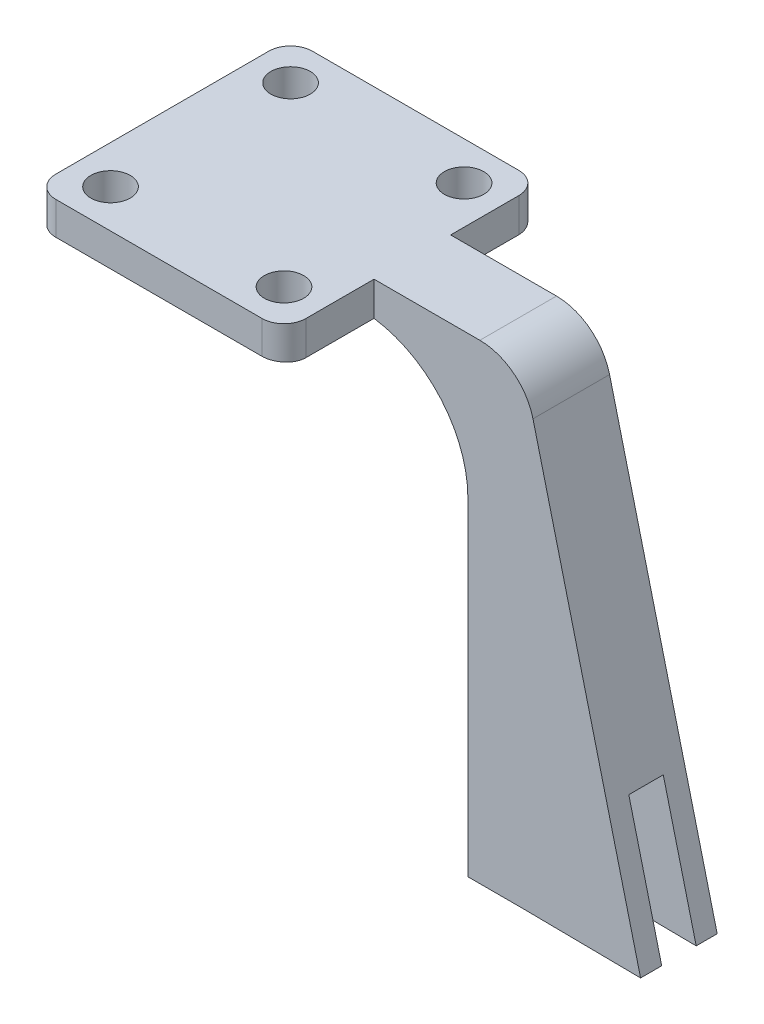
ISO-10303-21;
HEADER;
FILE_DESCRIPTION(('STEP AP214'),'2;1');
FILE_NAME('part.step','',(''),(''),'','','');
FILE_SCHEMA(('AUTOMOTIVE_DESIGN { 1 0 10303 214 1 1 1 1 }'));
ENDSEC;
DATA;
#1=APPLICATION_CONTEXT('core data for automotive mechanical design processes');
#2=APPLICATION_PROTOCOL_DEFINITION('international standard','automotive_design',2000,#1);
#3=PRODUCT_CONTEXT('',#1,'mechanical');
#4=PRODUCT('Part','Part','',(#3));
#5=PRODUCT_RELATED_PRODUCT_CATEGORY('part','',(#4));
#6=PRODUCT_DEFINITION_FORMATION('','',#4);
#7=PRODUCT_DEFINITION_CONTEXT('part definition',#1,'design');
#8=PRODUCT_DEFINITION('design','',#6,#7);
#9=PRODUCT_DEFINITION_SHAPE('','',#8);
#10=(LENGTH_UNIT() NAMED_UNIT(*) SI_UNIT(.MILLI.,.METRE.));
#11=(NAMED_UNIT(*) PLANE_ANGLE_UNIT() SI_UNIT($,.RADIAN.));
#12=(NAMED_UNIT(*) SI_UNIT($,.STERADIAN.) SOLID_ANGLE_UNIT());
#13=UNCERTAINTY_MEASURE_WITH_UNIT(LENGTH_MEASURE(1.E-05),#10,'distance_accuracy_value','');
#14=(GEOMETRIC_REPRESENTATION_CONTEXT(3) GLOBAL_UNCERTAINTY_ASSIGNED_CONTEXT((#13)) GLOBAL_UNIT_ASSIGNED_CONTEXT((#10,
#11,#12)) REPRESENTATION_CONTEXT('',''));
#15=CARTESIAN_POINT('',(0.,0.,0.));
#16=DIRECTION('',(0.,0.,1.));
#17=DIRECTION('',(1.,0.,0.));
#18=AXIS2_PLACEMENT_3D('',#15,#16,#17);
#19=CARTESIAN_POINT('',(0.,-40.,0.));
#20=DIRECTION('',(0.,1.,0.));
#21=DIRECTION('',(0.,0.,1.));
#22=AXIS2_PLACEMENT_3D('',#19,#20,#21);
#23=PLANE('',#22);
#24=DIRECTION('',(0.,0.,1.));
#25=VECTOR('',#24,1.);
#26=CARTESIAN_POINT('',(25.,-40.,3.5));
#27=LINE('',#26,#25);
#28=CARTESIAN_POINT('',(25.,-40.,-1.5809807270364));
#29=VERTEX_POINT('',#28);
#30=CARTESIAN_POINT('',(25.,-40.,-1.575));
#31=VERTEX_POINT('',#30);
#32=EDGE_CURVE('E291',#29,#31,#27,.T.);
#33=ORIENTED_EDGE('',*,*,#32,.T.);
#34=DIRECTION('',(1.,0.,0.));
#35=VECTOR('',#34,1.);
#36=CARTESIAN_POINT('',(19.442722637308,-40.,-1.575));
#37=LINE('',#36,#35);
#38=CARTESIAN_POINT('',(20.,-40.,-1.575));
#39=VERTEX_POINT('',#38);
#40=EDGE_CURVE('E49',#39,#31,#37,.T.);
#41=ORIENTED_EDGE('',*,*,#40,.F.);
#42=DIRECTION('',(0.,0.,-1.));
#43=VECTOR('',#42,1.);
#44=CARTESIAN_POINT('',(20.,-40.,3.5));
#45=LINE('',#44,#43);
#46=CARTESIAN_POINT('',(20.,-40.,-3.5));
#47=VERTEX_POINT('',#46);
#48=EDGE_CURVE('E293',#39,#47,#45,.T.);
#49=ORIENTED_EDGE('',*,*,#48,.T.);
#50=DIRECTION('',(1.,0.,0.));
#51=VECTOR('',#50,1.);
#52=CARTESIAN_POINT('',(25.,-40.,-3.5));
#53=LINE('',#52,#51);
#54=CARTESIAN_POINT('',(25.,-40.,-3.5));
#55=VERTEX_POINT('',#54);
#56=EDGE_CURVE('E297',#47,#55,#53,.T.);
#57=ORIENTED_EDGE('',*,*,#56,.T.);
#58=EDGE_CURVE('E287',#55,#29,#27,.T.);
#59=ORIENTED_EDGE('',*,*,#58,.T.);
#60=EDGE_LOOP('',(#33,#41,#49,#57,#59));
#61=FACE_BOUND('',#60,.T.);
#62=ADVANCED_FACE('F35',(#61),#23,.F.);
#63=CARTESIAN_POINT('',(25.,-40.,-3.5));
#64=DIRECTION('',(-0.0111240680692946,-0.999938125640577,0.));
#65=DIRECTION('',(0.999938125640577,-0.0111240680692946,0.));
#66=AXIS2_PLACEMENT_3D('',#63,#64,#65);
#67=PLANE('',#66);
#68=DIRECTION('',(0.999938125640577,-0.0111240680692946,0.));
#69=VECTOR('',#68,1.);
#70=CARTESIAN_POINT('',(25.,-40.,-1.5809807270364));
#71=LINE('',#70,#69);
#72=CARTESIAN_POINT('',(35.779116368611,-40.1199150438778,-1.5809807270364));
#73=VERTEX_POINT('',#72);
#74=EDGE_CURVE('E498',#29,#73,#71,.T.);
#75=ORIENTED_EDGE('',*,*,#74,.F.);
#76=ORIENTED_EDGE('',*,*,#58,.F.);
#77=DIRECTION('',(0.999938125640577,-0.0111240680692946,0.));
#78=VECTOR('',#77,1.);
#79=CARTESIAN_POINT('',(25.,-40.,-3.5));
#80=LINE('',#79,#78);
#81=CARTESIAN_POINT('',(35.779116368611,-40.1199150438778,-3.5));
#82=VERTEX_POINT('',#81);
#83=EDGE_CURVE('E271',#55,#82,#80,.T.);
#84=ORIENTED_EDGE('',*,*,#83,.T.);
#85=DIRECTION('',(0.,0.,1.));
#86=VECTOR('',#85,1.);
#87=CARTESIAN_POINT('',(35.779116368611,-40.1199150438778,-3.5));
#88=LINE('',#87,#86);
#89=EDGE_CURVE('E283',#82,#73,#88,.T.);
#90=ORIENTED_EDGE('',*,*,#89,.T.);
#91=EDGE_LOOP('',(#75,#76,#84,#90));
#92=FACE_BOUND('',#91,.T.);
#93=ADVANCED_FACE('F455',(#92),#67,.T.);
#94=CARTESIAN_POINT('',(11.425,3.,9.72499999999999));
#95=DIRECTION('',(-1.,0.,0.));
#96=DIRECTION('',(0.,0.,1.));
#97=AXIS2_PLACEMENT_3D('',#94,#95,#96);
#98=PLANE('',#97);
#99=DIRECTION('',(0.,0.,-1.));
#100=VECTOR('',#99,1.);
#101=CARTESIAN_POINT('',(11.425,3.,9.72499999999999));
#102=LINE('',#101,#100);
#103=CARTESIAN_POINT('',(11.425,3.,-3.5));
#104=VERTEX_POINT('',#103);
#105=CARTESIAN_POINT('',(11.425,3.,-9.72499999999998));
#106=VERTEX_POINT('',#105);
#107=EDGE_CURVE('E343',#104,#106,#102,.T.);
#108=ORIENTED_EDGE('',*,*,#107,.F.);
#109=DIRECTION('',(0.,-1.,0.));
#110=VECTOR('',#109,1.);
#111=CARTESIAN_POINT('',(11.425,3.,-3.5));
#112=LINE('',#111,#110);
#113=CARTESIAN_POINT('',(11.425,-0.102051980334513,-3.5));
#114=VERTEX_POINT('',#113);
#115=EDGE_CURVE('E394',#104,#114,#112,.T.);
#116=ORIENTED_EDGE('',*,*,#115,.T.);
#117=DIRECTION('',(0.,0.,-1.));
#118=VECTOR('',#117,1.);
#119=CARTESIAN_POINT('',(11.425,-0.102051980334513,-3.5));
#120=LINE('',#119,#118);
#121=CARTESIAN_POINT('',(11.425,-0.102051980334513,-9.72499999999998));
#122=VERTEX_POINT('',#121);
#123=EDGE_CURVE('E404',#114,#122,#120,.T.);
#124=ORIENTED_EDGE('',*,*,#123,.T.);
#125=DIRECTION('',(0.,-1.,0.));
#126=VECTOR('',#125,1.);
#127=CARTESIAN_POINT('',(11.425,3.,-9.72499999999998));
#128=LINE('',#127,#126);
#129=EDGE_CURVE('E381',#106,#122,#128,.T.);
#130=ORIENTED_EDGE('',*,*,#129,.F.);
#131=EDGE_LOOP('',(#108,#116,#124,#130));
#132=FACE_BOUND('',#131,.T.);
#133=ADVANCED_FACE('F447',(#132),#98,.F.);
#134=CARTESIAN_POINT('',(-9.425,3.,9.725));
#135=DIRECTION('',(0.,-1.,0.));
#136=DIRECTION('',(0.,0.,-1.));
#137=AXIS2_PLACEMENT_3D('',#134,#135,#136);
#138=PLANE('',#137);
#139=DIRECTION('',(1.,0.,0.));
#140=VECTOR('',#139,1.);
#141=CARTESIAN_POINT('',(0.,3.,3.5));
#142=LINE('',#141,#140);
#143=CARTESIAN_POINT('',(11.425,3.,3.5));
#144=VERTEX_POINT('',#143);
#145=CARTESIAN_POINT('',(21.0960422211493,3.,3.5));
#146=VERTEX_POINT('',#145);
#147=EDGE_CURVE('E305',#144,#146,#142,.T.);
#148=ORIENTED_EDGE('',*,*,#147,.T.);
#149=DIRECTION('',(0.,0.,-1.));
#150=VECTOR('',#149,1.);
#151=CARTESIAN_POINT('',(21.0960422211493,3.,-3.5));
#152=LINE('',#151,#150);
#153=CARTESIAN_POINT('',(21.0960422211493,3.,-3.5));
#154=VERTEX_POINT('',#153);
#155=EDGE_CURVE('E509',#146,#154,#152,.T.);
#156=ORIENTED_EDGE('',*,*,#155,.T.);
#157=DIRECTION('',(-1.,0.,0.));
#158=VECTOR('',#157,1.);
#159=CARTESIAN_POINT('',(0.,3.,-3.5));
#160=LINE('',#159,#158);
#161=EDGE_CURVE('E308',#154,#104,#160,.T.);
#162=ORIENTED_EDGE('',*,*,#161,.T.);
#163=ORIENTED_EDGE('',*,*,#107,.T.);
#164=CARTESIAN_POINT('',(9.425,3.,-9.725));
#165=DIRECTION('',(0.,1.,0.));
#166=DIRECTION('',(0.,0.,-1.));
#167=AXIS2_PLACEMENT_3D('',#164,#165,#166);
#168=CIRCLE('',#167,2.);
#169=CARTESIAN_POINT('',(9.42499999999999,3.,-11.725));
#170=VERTEX_POINT('',#169);
#171=EDGE_CURVE('E347',#106,#170,#168,.T.);
#172=ORIENTED_EDGE('',*,*,#171,.T.);
#173=DIRECTION('',(-1.,0.,0.));
#174=VECTOR('',#173,1.);
#175=CARTESIAN_POINT('',(-9.42499999999999,3.,-11.725));
#176=LINE('',#175,#174);
#177=CARTESIAN_POINT('',(-9.42499999999999,3.,-11.725));
#178=VERTEX_POINT('',#177);
#179=EDGE_CURVE('E349',#170,#178,#176,.T.);
#180=ORIENTED_EDGE('',*,*,#179,.T.);
#181=CARTESIAN_POINT('',(-9.425,3.,-9.725));
#182=DIRECTION('',(0.,1.,0.));
#183=DIRECTION('',(0.,0.,-1.));
#184=AXIS2_PLACEMENT_3D('',#181,#182,#183);
#185=CIRCLE('',#184,2.);
#186=CARTESIAN_POINT('',(-11.425,3.,-9.72499999999998));
#187=VERTEX_POINT('',#186);
#188=EDGE_CURVE('E351',#178,#187,#185,.T.);
#189=ORIENTED_EDGE('',*,*,#188,.T.);
#190=DIRECTION('',(0.,0.,1.));
#191=VECTOR('',#190,1.);
#192=CARTESIAN_POINT('',(-11.425,3.,9.72499999999999));
#193=LINE('',#192,#191);
#194=CARTESIAN_POINT('',(-11.425,3.,9.72499999999999));
#195=VERTEX_POINT('',#194);
#196=EDGE_CURVE('E353',#187,#195,#193,.T.);
#197=ORIENTED_EDGE('',*,*,#196,.T.);
#198=CARTESIAN_POINT('',(-9.425,3.,9.725));
#199=DIRECTION('',(0.,1.,0.));
#200=DIRECTION('',(0.,0.,-1.));
#201=AXIS2_PLACEMENT_3D('',#198,#199,#200);
#202=CIRCLE('',#201,2.);
#203=CARTESIAN_POINT('',(-9.42499999999999,3.,11.725));
#204=VERTEX_POINT('',#203);
#205=EDGE_CURVE('E335',#195,#204,#202,.T.);
#206=ORIENTED_EDGE('',*,*,#205,.T.);
#207=DIRECTION('',(1.,0.,0.));
#208=VECTOR('',#207,1.);
#209=CARTESIAN_POINT('',(-9.42499999999999,3.,11.725));
#210=LINE('',#209,#208);
#211=CARTESIAN_POINT('',(9.42499999999999,3.,11.725));
#212=VERTEX_POINT('',#211);
#213=EDGE_CURVE('E338',#204,#212,#210,.T.);
#214=ORIENTED_EDGE('',*,*,#213,.T.);
#215=CARTESIAN_POINT('',(9.425,3.,9.725));
#216=DIRECTION('',(0.,1.,0.));
#217=DIRECTION('',(0.,0.,1.));
#218=AXIS2_PLACEMENT_3D('',#215,#216,#217);
#219=CIRCLE('',#218,2.);
#220=CARTESIAN_POINT('',(11.425,3.,9.72499999999999));
#221=VERTEX_POINT('',#220);
#222=EDGE_CURVE('E341',#212,#221,#219,.T.);
#223=ORIENTED_EDGE('',*,*,#222,.T.);
#224=EDGE_CURVE('E344',#221,#144,#102,.T.);
#225=ORIENTED_EDGE('',*,*,#224,.T.);
#226=EDGE_LOOP('',(#148,#156,#162,#163,#172,#180,#189,#197,#206,#214,#223,#225));
#227=FACE_BOUND('',#226,.T.);
#228=CARTESIAN_POINT('',(7.925,3.,-8.225));
#229=DIRECTION('',(0.,1.,0.));
#230=DIRECTION('',(0.,0.,1.));
#231=AXIS2_PLACEMENT_3D('',#228,#229,#230);
#232=CIRCLE('',#231,1.8);
#233=CARTESIAN_POINT('',(7.925,3.,-6.425));
#234=VERTEX_POINT('',#233);
#235=EDGE_CURVE('E315',#234,#234,#232,.T.);
#236=ORIENTED_EDGE('',*,*,#235,.F.);
#237=EDGE_LOOP('',(#236));
#238=FACE_BOUND('',#237,.T.);
#239=CARTESIAN_POINT('',(-7.925,3.,8.225));
#240=DIRECTION('',(0.,1.,0.));
#241=DIRECTION('',(0.,0.,1.));
#242=AXIS2_PLACEMENT_3D('',#239,#240,#241);
#243=CIRCLE('',#242,1.8);
#244=CARTESIAN_POINT('',(-7.925,3.,10.025));
#245=VERTEX_POINT('',#244);
#246=EDGE_CURVE('E321',#245,#245,#243,.T.);
#247=ORIENTED_EDGE('',*,*,#246,.F.);
#248=EDGE_LOOP('',(#247));
#249=FACE_BOUND('',#248,.T.);
#250=CARTESIAN_POINT('',(7.925,3.,8.225));
#251=DIRECTION('',(0.,1.,0.));
#252=DIRECTION('',(0.,0.,1.));
#253=AXIS2_PLACEMENT_3D('',#250,#251,#252);
#254=CIRCLE('',#253,1.8);
#255=CARTESIAN_POINT('',(7.925,3.,10.025));
#256=VERTEX_POINT('',#255);
#257=EDGE_CURVE('E310',#256,#256,#254,.T.);
#258=ORIENTED_EDGE('',*,*,#257,.F.);
#259=EDGE_LOOP('',(#258));
#260=FACE_BOUND('',#259,.T.);
#261=CARTESIAN_POINT('',(-7.925,3.,-8.225));
#262=DIRECTION('',(0.,1.,0.));
#263=DIRECTION('',(0.,0.,1.));
#264=AXIS2_PLACEMENT_3D('',#261,#262,#263);
#265=CIRCLE('',#264,1.8);
#266=CARTESIAN_POINT('',(-7.925,3.,-6.425));
#267=VERTEX_POINT('',#266);
#268=EDGE_CURVE('E329',#267,#267,#265,.T.);
#269=ORIENTED_EDGE('',*,*,#268,.F.);
#270=EDGE_LOOP('',(#269));
#271=FACE_BOUND('',#270,.T.);
#272=ADVANCED_FACE('F454',(#227,#238,#249,#260,#271),#138,.F.);
#273=CARTESIAN_POINT('',(-9.425,0.,9.725));
#274=DIRECTION('',(0.,-1.,0.));
#275=DIRECTION('',(0.,0.,-1.));
#276=AXIS2_PLACEMENT_3D('',#273,#274,#275);
#277=PLANE('',#276);
#278=CARTESIAN_POINT('',(9.425,0.,-9.725));
#279=DIRECTION('',(0.,1.,0.));
#280=DIRECTION('',(0.,0.,-1.));
#281=AXIS2_PLACEMENT_3D('',#278,#279,#280);
#282=CIRCLE('',#281,2.);
#283=CARTESIAN_POINT('',(10.,0.,-11.6405612754491));
#284=VERTEX_POINT('',#283);
#285=CARTESIAN_POINT('',(9.42499999999999,0.,-11.725));
#286=VERTEX_POINT('',#285);
#287=EDGE_CURVE('E363',#284,#286,#282,.T.);
#288=ORIENTED_EDGE('',*,*,#287,.F.);
#289=DIRECTION('',(0.,0.,-1.));
#290=VECTOR('',#289,1.);
#291=CARTESIAN_POINT('',(10.,0.,9.725));
#292=LINE('',#291,#290);
#293=CARTESIAN_POINT('',(10.,0.,11.6405612754491));
#294=VERTEX_POINT('',#293);
#295=EDGE_CURVE('E399',#284,#294,#292,.F.);
#296=ORIENTED_EDGE('',*,*,#295,.T.);
#297=CARTESIAN_POINT('',(9.425,0.,9.725));
#298=DIRECTION('',(0.,1.,0.));
#299=DIRECTION('',(0.,0.,1.));
#300=AXIS2_PLACEMENT_3D('',#297,#298,#299);
#301=CIRCLE('',#300,2.);
#302=CARTESIAN_POINT('',(9.42499999999999,0.,11.725));
#303=VERTEX_POINT('',#302);
#304=EDGE_CURVE('E360',#303,#294,#301,.T.);
#305=ORIENTED_EDGE('',*,*,#304,.F.);
#306=DIRECTION('',(1.,0.,0.));
#307=VECTOR('',#306,1.);
#308=CARTESIAN_POINT('',(-9.42499999999999,0.,11.725));
#309=LINE('',#308,#307);
#310=CARTESIAN_POINT('',(-9.42499999999999,0.,11.725));
#311=VERTEX_POINT('',#310);
#312=EDGE_CURVE('E358',#311,#303,#309,.T.);
#313=ORIENTED_EDGE('',*,*,#312,.F.);
#314=CARTESIAN_POINT('',(-9.425,0.,9.725));
#315=DIRECTION('',(0.,1.,0.));
#316=DIRECTION('',(0.,0.,-1.));
#317=AXIS2_PLACEMENT_3D('',#314,#315,#316);
#318=CIRCLE('',#317,2.);
#319=CARTESIAN_POINT('',(-11.425,0.,9.72499999999999));
#320=VERTEX_POINT('',#319);
#321=EDGE_CURVE('E332',#320,#311,#318,.T.);
#322=ORIENTED_EDGE('',*,*,#321,.F.);
#323=DIRECTION('',(0.,0.,1.));
#324=VECTOR('',#323,1.);
#325=CARTESIAN_POINT('',(-11.425,0.,9.72499999999999));
#326=LINE('',#325,#324);
#327=CARTESIAN_POINT('',(-11.425,0.,-9.72499999999998));
#328=VERTEX_POINT('',#327);
#329=EDGE_CURVE('E339',#328,#320,#326,.T.);
#330=ORIENTED_EDGE('',*,*,#329,.F.);
#331=CARTESIAN_POINT('',(-9.425,0.,-9.725));
#332=DIRECTION('',(0.,1.,0.));
#333=DIRECTION('',(0.,0.,-1.));
#334=AXIS2_PLACEMENT_3D('',#331,#332,#333);
#335=CIRCLE('',#334,2.);
#336=CARTESIAN_POINT('',(-9.42499999999999,0.,-11.725));
#337=VERTEX_POINT('',#336);
#338=EDGE_CURVE('E367',#337,#328,#335,.T.);
#339=ORIENTED_EDGE('',*,*,#338,.F.);
#340=DIRECTION('',(-1.,0.,0.));
#341=VECTOR('',#340,1.);
#342=CARTESIAN_POINT('',(-9.42499999999999,0.,-11.725));
#343=LINE('',#342,#341);
#344=EDGE_CURVE('E365',#286,#337,#343,.T.);
#345=ORIENTED_EDGE('',*,*,#344,.F.);
#346=EDGE_LOOP('',(#288,#296,#305,#313,#322,#330,#339,#345));
#347=FACE_BOUND('',#346,.T.);
#348=CARTESIAN_POINT('',(7.925,0.,-8.225));
#349=DIRECTION('',(0.,1.,0.));
#350=DIRECTION('',(0.,0.,1.));
#351=AXIS2_PLACEMENT_3D('',#348,#349,#350);
#352=CIRCLE('',#351,1.8);
#353=CARTESIAN_POINT('',(7.925,0.,-6.425));
#354=VERTEX_POINT('',#353);
#355=EDGE_CURVE('E311',#354,#354,#352,.T.);
#356=ORIENTED_EDGE('',*,*,#355,.T.);
#357=EDGE_LOOP('',(#356));
#358=FACE_BOUND('',#357,.T.);
#359=CARTESIAN_POINT('',(-7.925,0.,8.225));
#360=DIRECTION('',(0.,1.,0.));
#361=DIRECTION('',(0.,0.,1.));
#362=AXIS2_PLACEMENT_3D('',#359,#360,#361);
#363=CIRCLE('',#362,1.8);
#364=CARTESIAN_POINT('',(-7.925,0.,10.025));
#365=VERTEX_POINT('',#364);
#366=EDGE_CURVE('E318',#365,#365,#363,.T.);
#367=ORIENTED_EDGE('',*,*,#366,.T.);
#368=EDGE_LOOP('',(#367));
#369=FACE_BOUND('',#368,.T.);
#370=CARTESIAN_POINT('',(7.925,0.,8.225));
#371=DIRECTION('',(0.,1.,0.));
#372=DIRECTION('',(0.,0.,1.));
#373=AXIS2_PLACEMENT_3D('',#370,#371,#372);
#374=CIRCLE('',#373,1.8);
#375=CARTESIAN_POINT('',(7.925,0.,10.025));
#376=VERTEX_POINT('',#375);
#377=EDGE_CURVE('E324',#376,#376,#374,.T.);
#378=ORIENTED_EDGE('',*,*,#377,.T.);
#379=EDGE_LOOP('',(#378));
#380=FACE_BOUND('',#379,.T.);
#381=CARTESIAN_POINT('',(-7.925,0.,-8.225));
#382=DIRECTION('',(0.,1.,0.));
#383=DIRECTION('',(0.,0.,1.));
#384=AXIS2_PLACEMENT_3D('',#381,#382,#383);
#385=CIRCLE('',#384,1.8);
#386=CARTESIAN_POINT('',(-7.925,0.,-6.425));
#387=VERTEX_POINT('',#386);
#388=EDGE_CURVE('E314',#387,#387,#385,.T.);
#389=ORIENTED_EDGE('',*,*,#388,.T.);
#390=EDGE_LOOP('',(#389));
#391=FACE_BOUND('',#390,.T.);
#392=ADVANCED_FACE('F436',(#347,#358,#369,#380,#391),#277,.T.);
#393=CARTESIAN_POINT('',(-9.425,3.,9.725));
#394=DIRECTION('',(0.,-1.,0.));
#395=DIRECTION('',(0.,0.,-1.));
#396=AXIS2_PLACEMENT_3D('',#393,#394,#395);
#397=CYLINDRICAL_SURFACE('',#396,2.);
#398=ORIENTED_EDGE('',*,*,#321,.T.);
#399=DIRECTION('',(0.,-1.,0.));
#400=VECTOR('',#399,1.);
#401=CARTESIAN_POINT('',(-9.42499999999999,3.,11.725));
#402=LINE('',#401,#400);
#403=EDGE_CURVE('E388',#204,#311,#402,.T.);
#404=ORIENTED_EDGE('',*,*,#403,.F.);
#405=ORIENTED_EDGE('',*,*,#205,.F.);
#406=DIRECTION('',(0.,-1.,0.));
#407=VECTOR('',#406,1.);
#408=CARTESIAN_POINT('',(-11.425,3.,9.72499999999999));
#409=LINE('',#408,#407);
#410=EDGE_CURVE('E355',#195,#320,#409,.T.);
#411=ORIENTED_EDGE('',*,*,#410,.T.);
#412=EDGE_LOOP('',(#398,#404,#405,#411));
#413=FACE_BOUND('',#412,.T.);
#414=ADVANCED_FACE('F431',(#413),#397,.T.);
#415=CARTESIAN_POINT('',(-9.42499999999999,3.,11.725));
#416=DIRECTION('',(0.,0.,-1.));
#417=DIRECTION('',(-1.,0.,0.));
#418=AXIS2_PLACEMENT_3D('',#415,#416,#417);
#419=PLANE('',#418);
#420=ORIENTED_EDGE('',*,*,#312,.T.);
#421=DIRECTION('',(0.,-1.,0.));
#422=VECTOR('',#421,1.);
#423=CARTESIAN_POINT('',(9.42499999999999,3.,11.725));
#424=LINE('',#423,#422);
#425=EDGE_CURVE('E385',#212,#303,#424,.T.);
#426=ORIENTED_EDGE('',*,*,#425,.F.);
#427=ORIENTED_EDGE('',*,*,#213,.F.);
#428=ORIENTED_EDGE('',*,*,#403,.T.);
#429=EDGE_LOOP('',(#420,#426,#427,#428));
#430=FACE_BOUND('',#429,.T.);
#431=ADVANCED_FACE('F435',(#430),#419,.F.);
#432=CARTESIAN_POINT('',(9.425,3.,9.725));
#433=DIRECTION('',(0.,-1.,0.));
#434=DIRECTION('',(0.,0.,-1.));
#435=AXIS2_PLACEMENT_3D('',#432,#433,#434);
#436=CYLINDRICAL_SURFACE('',#435,2.);
#437=ORIENTED_EDGE('',*,*,#304,.T.);
#438=CARTESIAN_POINT('',(10.,0.,11.6405612754491));
#439=CARTESIAN_POINT('',(10.0536107682373,2.14974802270114E-06,11.6244688814374));
#440=CARTESIAN_POINT('',(10.1065185448362,-0.000431519089938403,11.6061323698474));
#441=CARTESIAN_POINT('',(10.2105957528547,-0.00208267581475193,11.565100710308));
#442=CARTESIAN_POINT('',(10.2617654069824,-0.00330006288079816,11.5424061232633));
#443=CARTESIAN_POINT('',(10.4119983530876,-0.00799033266593136,11.4680669571496));
#444=CARTESIAN_POINT('',(10.5079921673039,-0.0125019888584742,11.4101047164093));
#445=CARTESIAN_POINT('',(10.6888568325729,-0.0233413178142933,11.2790772442394));
#446=CARTESIAN_POINT('',(10.773727002836,-0.0296691016527609,11.206011089124));
#447=CARTESIAN_POINT('',(10.930092652582,-0.0430380907293189,11.046793466164));
#448=CARTESIAN_POINT('',(11.0015887003891,-0.0500792656327379,10.9606425546291));
#449=CARTESIAN_POINT('',(11.1297864127336,-0.0638140079653594,10.7768404144946));
#450=CARTESIAN_POINT('',(11.1863571916575,-0.0705041129469905,10.6790976778097));
#451=CARTESIAN_POINT('',(11.2822950376479,-0.0824367555559699,10.4754128225554));
#452=CARTESIAN_POINT('',(11.321664950011,-0.0876795325414899,10.3694720634845));
#453=CARTESIAN_POINT('',(11.3760823909086,-0.0951011250909677,10.1738403157569));
#454=CARTESIAN_POINT('',(11.3943925805315,-0.0976799674244557,10.0850568555328));
#455=CARTESIAN_POINT('',(11.4188645740953,-0.101168946286222,9.90586151483613));
#456=CARTESIAN_POINT('',(11.4250344826096,-0.102080196032626,9.81545076142306));
#457=CARTESIAN_POINT('',(11.425,-0.102051980334512,9.72499999999999));
#458=B_SPLINE_CURVE_WITH_KNOTS('',3,(#438,#439,#440,#441,#442,#443,#444,#445,#446,#447,#448,
#449,#450,#451,#452,#453,#454,#455,#456,#457),.UNSPECIFIED.,.F.,.F.,(4,2,2,2,2,2,2,2,2,4),(0.,
0.167815613515973,0.335609642839073,0.670558892654138,1.00552863248438,1.34048413477182,
1.67828608443074,2.01603213510792,2.28727829165882,2.55834330897723),.UNSPECIFIED.);
#459=CARTESIAN_POINT('',(11.425,-0.102051980334513,9.72499999999999));
#460=VERTEX_POINT('',#459);
#461=EDGE_CURVE('E414',#294,#460,#458,.T.);
#462=ORIENTED_EDGE('',*,*,#461,.T.);
#463=DIRECTION('',(0.,-1.,0.));
#464=VECTOR('',#463,1.);
#465=CARTESIAN_POINT('',(11.425,3.,9.72499999999999));
#466=LINE('',#465,#464);
#467=EDGE_CURVE('E383',#221,#460,#466,.T.);
#468=ORIENTED_EDGE('',*,*,#467,.F.);
#469=ORIENTED_EDGE('',*,*,#222,.F.);
#470=ORIENTED_EDGE('',*,*,#425,.T.);
#471=EDGE_LOOP('',(#437,#462,#468,#469,#470));
#472=FACE_BOUND('',#471,.T.);
#473=ADVANCED_FACE('F439',(#472),#436,.T.);
#474=ORIENTED_EDGE('',*,*,#467,.T.);
#475=DIRECTION('',(0.,0.,-1.));
#476=VECTOR('',#475,1.);
#477=CARTESIAN_POINT('',(11.425,-0.102051980334513,9.72499999999999));
#478=LINE('',#477,#476);
#479=CARTESIAN_POINT('',(11.425,-0.102051980334513,3.5));
#480=VERTEX_POINT('',#479);
#481=EDGE_CURVE('E513',#460,#480,#478,.T.);
#482=ORIENTED_EDGE('',*,*,#481,.T.);
#483=DIRECTION('',(0.,1.,0.));
#484=VECTOR('',#483,1.);
#485=CARTESIAN_POINT('',(11.425,3.,3.5));
#486=LINE('',#485,#484);
#487=EDGE_CURVE('E391',#480,#144,#486,.T.);
#488=ORIENTED_EDGE('',*,*,#487,.T.);
#489=ORIENTED_EDGE('',*,*,#224,.F.);
#490=EDGE_LOOP('',(#474,#482,#488,#489));
#491=FACE_BOUND('',#490,.T.);
#492=ADVANCED_FACE('F443',(#491),#98,.F.);
#493=CARTESIAN_POINT('',(9.425,3.,-9.725));
#494=DIRECTION('',(0.,-1.,0.));
#495=DIRECTION('',(0.,0.,-1.));
#496=AXIS2_PLACEMENT_3D('',#493,#494,#495);
#497=CYLINDRICAL_SURFACE('',#496,2.);
#498=ORIENTED_EDGE('',*,*,#129,.T.);
#499=CARTESIAN_POINT('',(11.425,-0.102051980334513,-9.72499999999998));
#500=CARTESIAN_POINT('',(11.4249999665442,-0.102054750667517,-9.78099875731475));
#501=CARTESIAN_POINT('',(11.4226466227627,-0.101712861202037,-9.83697033783914));
#502=CARTESIAN_POINT('',(11.4132604552421,-0.100367272015691,-9.94850658385105));
#503=CARTESIAN_POINT('',(11.4062280601507,-0.0993636329177724,-10.0040712861413));
#504=CARTESIAN_POINT('',(11.3781878113207,-0.0954062544780878,-10.1694326389668));
#505=CARTESIAN_POINT('',(11.350236656508,-0.0915058517494235,-10.2781113250215));
#506=CARTESIAN_POINT('',(11.276638448176,-0.0817564645741868,-10.4891640645096));
#507=CARTESIAN_POINT('',(11.2309878205355,-0.0759070865972733,-10.591536839725));
#508=CARTESIAN_POINT('',(11.1232933580447,-0.0631422782218143,-10.7871967919845));
#509=CARTESIAN_POINT('',(11.0612502112341,-0.0562268925716499,-10.8804843501355));
#510=CARTESIAN_POINT('',(10.9220184004184,-0.0423499008913388,-11.0560048303528));
#511=CARTESIAN_POINT('',(10.8447297422831,-0.0353882999075089,-11.1381583762765));
#512=CARTESIAN_POINT('',(10.6774006214553,-0.0226178373393261,-11.2883696887799));
#513=CARTESIAN_POINT('',(10.5873625431491,-0.0168087606974666,-11.3564300852018));
#514=CARTESIAN_POINT('',(10.4157749065858,-0.00835515281294174,-11.4646952330976));
#515=CARTESIAN_POINT('',(10.3360236936689,-0.00531342660331091,-11.5077452218215));
#516=CARTESIAN_POINT('',(10.1714557134689,-0.00112599693797162,-11.5826890895976));
#517=CARTESIAN_POINT('',(10.0866420206681,2.08453972830062E-05,-11.6145896606713));
#518=CARTESIAN_POINT('',(10.,0.,-11.6405612754491));
#519=B_SPLINE_CURVE_WITH_KNOTS('',3,(#499,#500,#501,#502,#503,#504,#505,#506,#507,#508,#509,
#510,#511,#512,#513,#514,#515,#516,#517,#518),.UNSPECIFIED.,.F.,.F.,(4,2,2,2,2,2,2,2,2,4),(0.,
0.167892012347056,0.335768646227017,0.670885821043207,1.00607070260739,1.34124151776398,
1.67868852969198,2.01607251569956,2.28728907646116,2.55834256891711),.UNSPECIFIED.);
#520=EDGE_CURVE('E407',#122,#284,#519,.T.);
#521=ORIENTED_EDGE('',*,*,#520,.T.);
#522=ORIENTED_EDGE('',*,*,#287,.T.);
#523=DIRECTION('',(0.,-1.,0.));
#524=VECTOR('',#523,1.);
#525=CARTESIAN_POINT('',(9.42499999999999,3.,-11.725));
#526=LINE('',#525,#524);
#527=EDGE_CURVE('E378',#170,#286,#526,.T.);
#528=ORIENTED_EDGE('',*,*,#527,.F.);
#529=ORIENTED_EDGE('',*,*,#171,.F.);
#530=EDGE_LOOP('',(#498,#521,#522,#528,#529));
#531=FACE_BOUND('',#530,.T.);
#532=ADVANCED_FACE('F421',(#531),#497,.T.);
#533=CARTESIAN_POINT('',(-9.42499999999999,3.,-11.725));
#534=DIRECTION('',(0.,0.,1.));
#535=DIRECTION('',(1.,0.,0.));
#536=AXIS2_PLACEMENT_3D('',#533,#534,#535);
#537=PLANE('',#536);
#538=ORIENTED_EDGE('',*,*,#344,.T.);
#539=DIRECTION('',(0.,-1.,0.));
#540=VECTOR('',#539,1.);
#541=CARTESIAN_POINT('',(-9.42499999999999,3.,-11.725));
#542=LINE('',#541,#540);
#543=EDGE_CURVE('E375',#178,#337,#542,.T.);
#544=ORIENTED_EDGE('',*,*,#543,.F.);
#545=ORIENTED_EDGE('',*,*,#179,.F.);
#546=ORIENTED_EDGE('',*,*,#527,.T.);
#547=EDGE_LOOP('',(#538,#544,#545,#546));
#548=FACE_BOUND('',#547,.T.);
#549=ADVANCED_FACE('F451',(#548),#537,.F.);
#550=CARTESIAN_POINT('',(-9.425,3.,-9.725));
#551=DIRECTION('',(0.,-1.,0.));
#552=DIRECTION('',(0.,0.,-1.));
#553=AXIS2_PLACEMENT_3D('',#550,#551,#552);
#554=CYLINDRICAL_SURFACE('',#553,2.);
#555=ORIENTED_EDGE('',*,*,#338,.T.);
#556=DIRECTION('',(0.,-1.,0.));
#557=VECTOR('',#556,1.);
#558=CARTESIAN_POINT('',(-11.425,3.,-9.72499999999998));
#559=LINE('',#558,#557);
#560=EDGE_CURVE('E372',#187,#328,#559,.T.);
#561=ORIENTED_EDGE('',*,*,#560,.F.);
#562=ORIENTED_EDGE('',*,*,#188,.F.);
#563=ORIENTED_EDGE('',*,*,#543,.T.);
#564=EDGE_LOOP('',(#555,#561,#562,#563));
#565=FACE_BOUND('',#564,.T.);
#566=ADVANCED_FACE('F576',(#565),#554,.T.);
#567=CARTESIAN_POINT('',(-11.425,3.,9.72499999999999));
#568=DIRECTION('',(1.,0.,0.));
#569=DIRECTION('',(0.,0.,-1.));
#570=AXIS2_PLACEMENT_3D('',#567,#568,#569);
#571=PLANE('',#570);
#572=ORIENTED_EDGE('',*,*,#329,.T.);
#573=ORIENTED_EDGE('',*,*,#410,.F.);
#574=ORIENTED_EDGE('',*,*,#196,.F.);
#575=ORIENTED_EDGE('',*,*,#560,.T.);
#576=EDGE_LOOP('',(#572,#573,#574,#575));
#577=FACE_BOUND('',#576,.T.);
#578=ADVANCED_FACE('F582',(#577),#571,.F.);
#579=CARTESIAN_POINT('',(-7.925,3.,-8.225));
#580=DIRECTION('',(0.,-1.,0.));
#581=DIRECTION('',(0.,0.,-1.));
#582=AXIS2_PLACEMENT_3D('',#579,#580,#581);
#583=CYLINDRICAL_SURFACE('',#582,1.8);
#584=ORIENTED_EDGE('',*,*,#268,.T.);
#585=EDGE_LOOP('',(#584));
#586=FACE_BOUND('',#585,.T.);
#587=ORIENTED_EDGE('',*,*,#388,.F.);
#588=EDGE_LOOP('',(#587));
#589=FACE_BOUND('',#588,.T.);
#590=ADVANCED_FACE('F585',(#586,#589),#583,.F.);
#591=CARTESIAN_POINT('',(7.925,0.,8.225));
#592=DIRECTION('',(0.,1.,0.));
#593=DIRECTION('',(0.,0.,1.));
#594=AXIS2_PLACEMENT_3D('',#591,#592,#593);
#595=CYLINDRICAL_SURFACE('',#594,1.8);
#596=ORIENTED_EDGE('',*,*,#377,.F.);
#597=EDGE_LOOP('',(#596));
#598=FACE_BOUND('',#597,.T.);
#599=ORIENTED_EDGE('',*,*,#257,.T.);
#600=EDGE_LOOP('',(#599));
#601=FACE_BOUND('',#600,.T.);
#602=ADVANCED_FACE('F591',(#598,#601),#595,.F.);
#603=CARTESIAN_POINT('',(-7.925,0.,8.225));
#604=DIRECTION('',(0.,1.,0.));
#605=DIRECTION('',(0.,0.,1.));
#606=AXIS2_PLACEMENT_3D('',#603,#604,#605);
#607=CYLINDRICAL_SURFACE('',#606,1.8);
#608=ORIENTED_EDGE('',*,*,#366,.F.);
#609=EDGE_LOOP('',(#608));
#610=FACE_BOUND('',#609,.T.);
#611=ORIENTED_EDGE('',*,*,#246,.T.);
#612=EDGE_LOOP('',(#611));
#613=FACE_BOUND('',#612,.T.);
#614=ADVANCED_FACE('F626',(#610,#613),#607,.F.);
#615=CARTESIAN_POINT('',(7.925,0.,-8.225));
#616=DIRECTION('',(0.,1.,0.));
#617=DIRECTION('',(0.,0.,1.));
#618=AXIS2_PLACEMENT_3D('',#615,#616,#617);
#619=CYLINDRICAL_SURFACE('',#618,1.8);
#620=ORIENTED_EDGE('',*,*,#355,.F.);
#621=EDGE_LOOP('',(#620));
#622=FACE_BOUND('',#621,.T.);
#623=ORIENTED_EDGE('',*,*,#235,.T.);
#624=EDGE_LOOP('',(#623));
#625=FACE_BOUND('',#624,.T.);
#626=ADVANCED_FACE('F636',(#622,#625),#619,.F.);
#627=CARTESIAN_POINT('',(0.,0.,-3.5));
#628=DIRECTION('',(0.,0.,-1.));
#629=DIRECTION('',(-1.,0.,0.));
#630=AXIS2_PLACEMENT_3D('',#627,#628,#629);
#631=PLANE('',#630);
#632=ORIENTED_EDGE('',*,*,#161,.F.);
#633=CARTESIAN_POINT('',(21.0960422211493,-2.,-3.5));
#634=DIRECTION('',(0.,0.,-1.));
#635=DIRECTION('',(-1.,0.,0.));
#636=AXIS2_PLACEMENT_3D('',#633,#634,#635);
#637=CIRCLE('',#636,5.);
#638=CARTESIAN_POINT('',(25.9467775478491,-0.787413182363098,-3.5));
#639=VERTEX_POINT('',#638);
#640=EDGE_CURVE('E507',#154,#639,#637,.T.);
#641=ORIENTED_EDGE('',*,*,#640,.T.);
#642=DIRECTION('',(-0.242517363527381,0.970147065339956,0.));
#643=VECTOR('',#642,1.);
#644=CARTESIAN_POINT('',(25.,3.,-3.5));
#645=LINE('',#644,#643);
#646=EDGE_CURVE('E274',#82,#639,#645,.T.);
#647=ORIENTED_EDGE('',*,*,#646,.F.);
#648=ORIENTED_EDGE('',*,*,#83,.F.);
#649=ORIENTED_EDGE('',*,*,#56,.F.);
#650=DIRECTION('',(0.,1.,0.));
#651=VECTOR('',#650,1.);
#652=CARTESIAN_POINT('',(20.,-40.,-3.5));
#653=LINE('',#652,#651);
#654=CARTESIAN_POINT('',(20.,-10.,-3.5));
#655=VERTEX_POINT('',#654);
#656=EDGE_CURVE('E299',#47,#655,#653,.T.);
#657=ORIENTED_EDGE('',*,*,#656,.T.);
#658=CARTESIAN_POINT('',(10.,-10.,-3.5));
#659=DIRECTION('',(0.,0.,-1.));
#660=DIRECTION('',(-1.,0.,0.));
#661=AXIS2_PLACEMENT_3D('',#658,#659,#660);
#662=CIRCLE('',#661,10.);
#663=EDGE_CURVE('E401',#655,#114,#662,.F.);
#664=ORIENTED_EDGE('',*,*,#663,.T.);
#665=ORIENTED_EDGE('',*,*,#115,.F.);
#666=EDGE_LOOP('',(#632,#641,#647,#648,#649,#657,#664,#665));
#667=FACE_BOUND('',#666,.T.);
#668=ADVANCED_FACE('F543',(#667),#631,.T.);
#669=CARTESIAN_POINT('',(0.,0.,3.5));
#670=DIRECTION('',(0.,0.,1.));
#671=DIRECTION('',(1.,0.,0.));
#672=AXIS2_PLACEMENT_3D('',#669,#670,#671);
#673=PLANE('',#672);
#674=DIRECTION('',(-0.242517363527381,0.970147065339956,0.));
#675=VECTOR('',#674,1.);
#676=CARTESIAN_POINT('',(25.,3.,3.5));
#677=LINE('',#676,#675);
#678=CARTESIAN_POINT('',(35.779116368611,-40.1199150438778,3.5));
#679=VERTEX_POINT('',#678);
#680=CARTESIAN_POINT('',(25.9467775478491,-0.787413182363098,3.5));
#681=VERTEX_POINT('',#680);
#682=EDGE_CURVE('E275',#679,#681,#677,.T.);
#683=ORIENTED_EDGE('',*,*,#682,.T.);
#684=CARTESIAN_POINT('',(21.0960422211493,-2.,3.5));
#685=DIRECTION('',(0.,0.,1.));
#686=DIRECTION('',(1.,0.,0.));
#687=AXIS2_PLACEMENT_3D('',#684,#685,#686);
#688=CIRCLE('',#687,5.);
#689=EDGE_CURVE('E503',#681,#146,#688,.T.);
#690=ORIENTED_EDGE('',*,*,#689,.T.);
#691=ORIENTED_EDGE('',*,*,#147,.F.);
#692=ORIENTED_EDGE('',*,*,#487,.F.);
#693=CARTESIAN_POINT('',(10.,-10.,3.5));
#694=DIRECTION('',(0.,0.,1.));
#695=DIRECTION('',(1.,0.,0.));
#696=AXIS2_PLACEMENT_3D('',#693,#694,#695);
#697=CIRCLE('',#696,10.);
#698=CARTESIAN_POINT('',(20.,-10.,3.5));
#699=VERTEX_POINT('',#698);
#700=EDGE_CURVE('E512',#480,#699,#697,.F.);
#701=ORIENTED_EDGE('',*,*,#700,.T.);
#702=DIRECTION('',(0.,1.,0.));
#703=VECTOR('',#702,1.);
#704=CARTESIAN_POINT('',(20.,-40.,3.5));
#705=LINE('',#704,#703);
#706=CARTESIAN_POINT('',(20.,-40.,3.5));
#707=VERTEX_POINT('',#706);
#708=EDGE_CURVE('E302',#707,#699,#705,.T.);
#709=ORIENTED_EDGE('',*,*,#708,.F.);
#710=DIRECTION('',(-1.,0.,0.));
#711=VECTOR('',#710,1.);
#712=CARTESIAN_POINT('',(25.,-40.,3.5));
#713=LINE('',#712,#711);
#714=CARTESIAN_POINT('',(25.,-40.,3.5));
#715=VERTEX_POINT('',#714);
#716=EDGE_CURVE('E290',#715,#707,#713,.T.);
#717=ORIENTED_EDGE('',*,*,#716,.F.);
#718=DIRECTION('',(0.999938125640577,-0.0111240680692946,0.));
#719=VECTOR('',#718,1.);
#720=CARTESIAN_POINT('',(25.,-40.,3.5));
#721=LINE('',#720,#719);
#722=EDGE_CURVE('E270',#715,#679,#721,.T.);
#723=ORIENTED_EDGE('',*,*,#722,.T.);
#724=EDGE_LOOP('',(#683,#690,#691,#692,#701,#709,#717,#723));
#725=FACE_BOUND('',#724,.T.);
#726=ADVANCED_FACE('F478',(#725),#673,.T.);
#727=CARTESIAN_POINT('',(20.,-40.,3.5));
#728=DIRECTION('',(1.,0.,0.));
#729=DIRECTION('',(0.,0.,-1.));
#730=AXIS2_PLACEMENT_3D('',#727,#728,#729);
#731=PLANE('',#730);
#732=ORIENTED_EDGE('',*,*,#48,.F.);
#733=DIRECTION('',(0.,1.,0.));
#734=VECTOR('',#733,1.);
#735=CARTESIAN_POINT('',(20.,-40.,-1.575));
#736=LINE('',#735,#734);
#737=CARTESIAN_POINT('',(20.,-39.9443762179677,-1.575));
#738=VERTEX_POINT('',#737);
#739=EDGE_CURVE('E241',#39,#738,#736,.T.);
#740=ORIENTED_EDGE('',*,*,#739,.T.);
#741=DIRECTION('',(0.,0.,1.));
#742=VECTOR('',#741,1.);
#743=CARTESIAN_POINT('',(20.,-39.9443762179677,3.5));
#744=LINE('',#743,#742);
#745=CARTESIAN_POINT('',(20.,-39.9443762179677,-1.5809807270364));
#746=VERTEX_POINT('',#745);
#747=EDGE_CURVE('E264',#746,#738,#744,.T.);
#748=ORIENTED_EDGE('',*,*,#747,.F.);
#749=DIRECTION('',(0.,1.,0.));
#750=VECTOR('',#749,1.);
#751=CARTESIAN_POINT('',(20.,-40.,-1.5809807270364));
#752=LINE('',#751,#750);
#753=CARTESIAN_POINT('',(20.,-27.9436336797105,-1.5809807270364));
#754=VERTEX_POINT('',#753);
#755=EDGE_CURVE('E261',#746,#754,#752,.T.);
#756=ORIENTED_EDGE('',*,*,#755,.T.);
#757=DIRECTION('',(0.,0.,1.));
#758=VECTOR('',#757,1.);
#759=CARTESIAN_POINT('',(20.,-27.9436336797105,3.5));
#760=LINE('',#759,#758);
#761=CARTESIAN_POINT('',(20.,-27.9436336797105,1.5690192729636));
#762=VERTEX_POINT('',#761);
#763=EDGE_CURVE('E267',#754,#762,#760,.T.);
#764=ORIENTED_EDGE('',*,*,#763,.T.);
#765=DIRECTION('',(0.,-1.,0.));
#766=VECTOR('',#765,1.);
#767=CARTESIAN_POINT('',(20.,-40.,1.5690192729636));
#768=LINE('',#767,#766);
#769=CARTESIAN_POINT('',(20.,-29.,1.5690192729636));
#770=VERTEX_POINT('',#769);
#771=EDGE_CURVE('E256',#762,#770,#768,.T.);
#772=ORIENTED_EDGE('',*,*,#771,.T.);
#773=DIRECTION('',(0.,0.,1.));
#774=VECTOR('',#773,1.);
#775=CARTESIAN_POINT('',(20.,-29.,3.5));
#776=LINE('',#775,#774);
#777=CARTESIAN_POINT('',(20.,-29.,1.575));
#778=VERTEX_POINT('',#777);
#779=EDGE_CURVE('E228',#770,#778,#776,.T.);
#780=ORIENTED_EDGE('',*,*,#779,.T.);
#781=DIRECTION('',(0.,-1.,0.));
#782=VECTOR('',#781,1.);
#783=CARTESIAN_POINT('',(20.,-40.,1.575));
#784=LINE('',#783,#782);
#785=CARTESIAN_POINT('',(20.,-40.,1.575));
#786=VERTEX_POINT('',#785);
#787=EDGE_CURVE('E232',#778,#786,#784,.T.);
#788=ORIENTED_EDGE('',*,*,#787,.T.);
#789=EDGE_CURVE('E294',#707,#786,#45,.T.);
#790=ORIENTED_EDGE('',*,*,#789,.F.);
#791=ORIENTED_EDGE('',*,*,#708,.T.);
#792=DIRECTION('',(0.,0.,-1.));
#793=VECTOR('',#792,1.);
#794=CARTESIAN_POINT('',(20.,-10.,3.5));
#795=LINE('',#794,#793);
#796=EDGE_CURVE('E396',#699,#655,#795,.T.);
#797=ORIENTED_EDGE('',*,*,#796,.T.);
#798=ORIENTED_EDGE('',*,*,#656,.F.);
#799=EDGE_LOOP('',(#732,#740,#748,#756,#764,#772,#780,#788,#790,#791,#797,#798));
#800=FACE_BOUND('',#799,.T.);
#801=ADVANCED_FACE('F470',(#800),#731,.F.);
#802=ORIENTED_EDGE('',*,*,#789,.T.);
#803=DIRECTION('',(-1.,0.,0.));
#804=VECTOR('',#803,1.);
#805=CARTESIAN_POINT('',(19.442722637308,-40.,1.575));
#806=LINE('',#805,#804);
#807=CARTESIAN_POINT('',(25.,-40.,1.575));
#808=VERTEX_POINT('',#807);
#809=EDGE_CURVE('E236',#808,#786,#806,.T.);
#810=ORIENTED_EDGE('',*,*,#809,.F.);
#811=EDGE_CURVE('E286',#808,#715,#27,.T.);
#812=ORIENTED_EDGE('',*,*,#811,.T.);
#813=ORIENTED_EDGE('',*,*,#716,.T.);
#814=EDGE_LOOP('',(#802,#810,#812,#813));
#815=FACE_BOUND('',#814,.T.);
#816=ADVANCED_FACE('F460',(#815),#23,.F.);
#817=CARTESIAN_POINT('',(25.,3.,-3.5));
#818=DIRECTION('',(0.970147065339956,0.242517363527381,0.));
#819=DIRECTION('',(-0.242517363527381,0.970147065339956,0.));
#820=AXIS2_PLACEMENT_3D('',#817,#818,#819);
#821=PLANE('',#820);
#822=DIRECTION('',(-0.242517363527381,0.970147065339956,0.));
#823=VECTOR('',#822,1.);
#824=CARTESIAN_POINT('',(25.,3.,-1.5809807270364));
#825=LINE('',#824,#823);
#826=CARTESIAN_POINT('',(32.7708047330386,-28.0857057714802,-1.5809807270364));
#827=VERTEX_POINT('',#826);
#828=EDGE_CURVE('E259',#73,#827,#825,.T.);
#829=ORIENTED_EDGE('',*,*,#828,.F.);
#830=ORIENTED_EDGE('',*,*,#89,.F.);
#831=ORIENTED_EDGE('',*,*,#646,.T.);
#832=DIRECTION('',(0.,0.,-1.));
#833=VECTOR('',#832,1.);
#834=CARTESIAN_POINT('',(25.9467775478491,-0.787413182363098,3.5));
#835=LINE('',#834,#833);
#836=EDGE_CURVE('E505',#639,#681,#835,.F.);
#837=ORIENTED_EDGE('',*,*,#836,.T.);
#838=ORIENTED_EDGE('',*,*,#682,.F.);
#839=CARTESIAN_POINT('',(35.779116368611,-40.1199150438778,1.5690192729636));
#840=VERTEX_POINT('',#839);
#841=EDGE_CURVE('E278',#840,#679,#88,.T.);
#842=ORIENTED_EDGE('',*,*,#841,.F.);
#843=DIRECTION('',(0.242517363527381,-0.970147065339956,0.));
#844=VECTOR('',#843,1.);
#845=CARTESIAN_POINT('',(25.,3.,1.5690192729636));
#846=LINE('',#845,#844);
#847=CARTESIAN_POINT('',(32.7708047330386,-28.0857057714802,1.5690192729636));
#848=VERTEX_POINT('',#847);
#849=EDGE_CURVE('E252',#848,#840,#846,.T.);
#850=ORIENTED_EDGE('',*,*,#849,.F.);
#851=DIRECTION('',(0.,0.,1.));
#852=VECTOR('',#851,1.);
#853=CARTESIAN_POINT('',(32.7708047330386,-28.0857057714802,-3.5));
#854=LINE('',#853,#852);
#855=EDGE_CURVE('E496',#827,#848,#854,.T.);
#856=ORIENTED_EDGE('',*,*,#855,.F.);
#857=EDGE_LOOP('',(#829,#830,#831,#837,#838,#842,#850,#856));
#858=FACE_BOUND('',#857,.T.);
#859=ADVANCED_FACE('F469',(#858),#821,.T.);
#860=DIRECTION('',(-0.999938125640577,0.0111240680692946,0.));
#861=VECTOR('',#860,1.);
#862=CARTESIAN_POINT('',(25.,-40.,1.5690192729636));
#863=LINE('',#862,#861);
#864=CARTESIAN_POINT('',(24.9999999999987,-40.,1.5690192729636));
#865=VERTEX_POINT('',#864);
#866=EDGE_CURVE('E500',#840,#865,#863,.T.);
#867=ORIENTED_EDGE('',*,*,#866,.F.);
#868=ORIENTED_EDGE('',*,*,#841,.T.);
#869=ORIENTED_EDGE('',*,*,#722,.F.);
#870=ORIENTED_EDGE('',*,*,#811,.F.);
#871=EDGE_CURVE('E564',#865,#808,#27,.T.);
#872=ORIENTED_EDGE('',*,*,#871,.F.);
#873=EDGE_LOOP('',(#867,#868,#869,#870,#872));
#874=FACE_BOUND('',#873,.T.);
#875=ADVANCED_FACE('F429',(#874),#67,.T.);
#876=CARTESIAN_POINT('',(10.,-10.,3.5));
#877=DIRECTION('',(0.,0.,-1.));
#878=DIRECTION('',(-1.,0.,0.));
#879=AXIS2_PLACEMENT_3D('',#876,#877,#878);
#880=CYLINDRICAL_SURFACE('',#879,10.);
#881=ORIENTED_EDGE('',*,*,#461,.F.);
#882=ORIENTED_EDGE('',*,*,#295,.F.);
#883=ORIENTED_EDGE('',*,*,#520,.F.);
#884=ORIENTED_EDGE('',*,*,#123,.F.);
#885=ORIENTED_EDGE('',*,*,#663,.F.);
#886=ORIENTED_EDGE('',*,*,#796,.F.);
#887=ORIENTED_EDGE('',*,*,#700,.F.);
#888=ORIENTED_EDGE('',*,*,#481,.F.);
#889=EDGE_LOOP('',(#881,#882,#883,#884,#885,#886,#887,#888));
#890=FACE_BOUND('',#889,.T.);
#891=ADVANCED_FACE('F425',(#890),#880,.F.);
#892=CARTESIAN_POINT('',(21.0960422211493,-2.,9.725));
#893=DIRECTION('',(0.,0.,1.));
#894=DIRECTION('',(1.,0.,0.));
#895=AXIS2_PLACEMENT_3D('',#892,#893,#894);
#896=CYLINDRICAL_SURFACE('',#895,5.);
#897=ORIENTED_EDGE('',*,*,#689,.F.);
#898=ORIENTED_EDGE('',*,*,#836,.F.);
#899=ORIENTED_EDGE('',*,*,#640,.F.);
#900=ORIENTED_EDGE('',*,*,#155,.F.);
#901=EDGE_LOOP('',(#897,#898,#899,#900));
#902=FACE_BOUND('',#901,.T.);
#903=ADVANCED_FACE('F37',(#902),#896,.T.);
#904=CARTESIAN_POINT('',(-0.30835275189655,-27.717708202329,0.));
#905=DIRECTION('',(0.0111240680692945,0.999938125640577,0.));
#906=DIRECTION('',(-0.999938125640577,0.0111240680692945,0.));
#907=AXIS2_PLACEMENT_3D('',#904,#905,#906);
#908=PLANE('',#907);
#909=DIRECTION('',(0.999938125640577,-0.0111240680692945,0.));
#910=VECTOR('',#909,1.);
#911=CARTESIAN_POINT('',(19.4245006312136,-27.9372313894207,-1.5809807270364));
#912=LINE('',#911,#910);
#913=EDGE_CURVE('E249',#754,#827,#912,.T.);
#914=ORIENTED_EDGE('',*,*,#913,.T.);
#915=ORIENTED_EDGE('',*,*,#855,.T.);
#916=DIRECTION('',(-0.999938125640577,0.0111240680692945,0.));
#917=VECTOR('',#916,1.);
#918=CARTESIAN_POINT('',(19.4245006312136,-27.9372313894207,1.5690192729636));
#919=LINE('',#918,#917);
#920=EDGE_CURVE('E246',#848,#762,#919,.T.);
#921=ORIENTED_EDGE('',*,*,#920,.T.);
#922=ORIENTED_EDGE('',*,*,#763,.F.);
#923=EDGE_LOOP('',(#914,#915,#921,#922));
#924=FACE_BOUND('',#923,.T.);
#925=ADVANCED_FACE('F559',(#924),#908,.F.);
#926=CARTESIAN_POINT('',(-0.441841568728086,-39.7169657100159,0.));
#927=DIRECTION('',(0.0111240680692945,0.999938125640577,0.));
#928=DIRECTION('',(-0.999938125640577,0.0111240680692945,0.));
#929=AXIS2_PLACEMENT_3D('',#926,#927,#928);
#930=PLANE('',#929);
#931=DIRECTION('',(-0.999938125640577,0.0111240680692945,0.));
#932=VECTOR('',#931,1.);
#933=CARTESIAN_POINT('',(-0.441841568728086,-39.7169657100159,-1.575));
#934=LINE('',#933,#932);
#935=EDGE_CURVE('E11',#31,#738,#934,.T.);
#936=ORIENTED_EDGE('',*,*,#935,.F.);
#937=ORIENTED_EDGE('',*,*,#32,.F.);
#938=DIRECTION('',(0.999938125640577,-0.0111240680692945,0.));
#939=VECTOR('',#938,1.);
#940=CARTESIAN_POINT('',(19.2910118143821,-39.9364888971076,-1.5809807270364));
#941=LINE('',#940,#939);
#942=EDGE_CURVE('E245',#746,#29,#941,.T.);
#943=ORIENTED_EDGE('',*,*,#942,.F.);
#944=ORIENTED_EDGE('',*,*,#747,.T.);
#945=EDGE_LOOP('',(#936,#937,#943,#944));
#946=FACE_BOUND('',#945,.T.);
#947=ADVANCED_FACE('F739',(#946),#930,.T.);
#948=CARTESIAN_POINT('',(19.4245006312136,-27.9372313894207,-1.5809807270364));
#949=DIRECTION('',(0.,0.,-1.));
#950=DIRECTION('',(-1.,0.,0.));
#951=AXIS2_PLACEMENT_3D('',#948,#949,#950);
#952=PLANE('',#951);
#953=ORIENTED_EDGE('',*,*,#942,.T.);
#954=ORIENTED_EDGE('',*,*,#74,.T.);
#955=ORIENTED_EDGE('',*,*,#828,.T.);
#956=ORIENTED_EDGE('',*,*,#913,.F.);
#957=ORIENTED_EDGE('',*,*,#755,.F.);
#958=EDGE_LOOP('',(#953,#954,#955,#956,#957));
#959=FACE_BOUND('',#958,.T.);
#960=ADVANCED_FACE('F552',(#959),#952,.F.);
#961=CARTESIAN_POINT('',(19.4245006312136,-27.9372313894207,1.5690192729636));
#962=DIRECTION('',(0.,0.,1.));
#963=DIRECTION('',(1.,0.,0.));
#964=AXIS2_PLACEMENT_3D('',#961,#962,#963);
#965=PLANE('',#964);
#966=DIRECTION('',(0.,1.,0.));
#967=VECTOR('',#966,1.);
#968=CARTESIAN_POINT('',(25.5283913044622,-27.9372313894207,1.5690192729636));
#969=LINE('',#968,#967);
#970=CARTESIAN_POINT('',(25.5283913044622,-40.,1.5690192729636));
#971=VERTEX_POINT('',#970);
#972=CARTESIAN_POINT('',(25.5283913044622,-29.,1.5690192729636));
#973=VERTEX_POINT('',#972);
#974=EDGE_CURVE('E491',#971,#973,#969,.T.);
#975=ORIENTED_EDGE('',*,*,#974,.T.);
#976=DIRECTION('',(-1.,0.,0.));
#977=VECTOR('',#976,1.);
#978=CARTESIAN_POINT('',(19.4245006312136,-29.,1.5690192729636));
#979=LINE('',#978,#977);
#980=EDGE_CURVE('E43',#973,#770,#979,.T.);
#981=ORIENTED_EDGE('',*,*,#980,.T.);
#982=ORIENTED_EDGE('',*,*,#771,.F.);
#983=ORIENTED_EDGE('',*,*,#920,.F.);
#984=ORIENTED_EDGE('',*,*,#849,.T.);
#985=ORIENTED_EDGE('',*,*,#866,.T.);
#986=DIRECTION('',(-1.,0.,0.));
#987=VECTOR('',#986,1.);
#988=CARTESIAN_POINT('',(19.4245006312136,-40.,1.5690192729636));
#989=LINE('',#988,#987);
#990=EDGE_CURVE('E492',#971,#865,#989,.T.);
#991=ORIENTED_EDGE('',*,*,#990,.F.);
#992=EDGE_LOOP('',(#975,#981,#982,#983,#984,#985,#991));
#993=FACE_BOUND('',#992,.T.);
#994=ADVANCED_FACE('F488',(#993),#965,.F.);
#995=CARTESIAN_POINT('',(0.,-29.,0.));
#996=DIRECTION('',(0.,1.,0.));
#997=DIRECTION('',(0.,0.,1.));
#998=AXIS2_PLACEMENT_3D('',#995,#996,#997);
#999=PLANE('',#998);
#1000=ORIENTED_EDGE('',*,*,#980,.F.);
#1001=DIRECTION('',(0.,0.,1.));
#1002=VECTOR('',#1001,1.);
#1003=CARTESIAN_POINT('',(25.5283913044622,-29.,-1.575));
#1004=LINE('',#1003,#1002);
#1005=CARTESIAN_POINT('',(25.5283913044622,-29.,1.575));
#1006=VERTEX_POINT('',#1005);
#1007=EDGE_CURVE('E213',#973,#1006,#1004,.T.);
#1008=ORIENTED_EDGE('',*,*,#1007,.T.);
#1009=DIRECTION('',(-1.,0.,0.));
#1010=VECTOR('',#1009,1.);
#1011=CARTESIAN_POINT('',(19.442722637308,-29.,1.575));
#1012=LINE('',#1011,#1010);
#1013=EDGE_CURVE('E217',#1006,#778,#1012,.T.);
#1014=ORIENTED_EDGE('',*,*,#1013,.T.);
#1015=ORIENTED_EDGE('',*,*,#779,.F.);
#1016=EDGE_LOOP('',(#1000,#1008,#1014,#1015));
#1017=FACE_BOUND('',#1016,.T.);
#1018=ADVANCED_FACE('F215',(#1017),#999,.F.);
#1019=CARTESIAN_POINT('',(0.,-40.,0.));
#1020=DIRECTION('',(0.,1.,0.));
#1021=DIRECTION('',(0.,0.,1.));
#1022=AXIS2_PLACEMENT_3D('',#1019,#1020,#1021);
#1023=PLANE('',#1022);
#1024=CARTESIAN_POINT('',(25.5283913044622,-40.,1.575));
#1025=VERTEX_POINT('',#1024);
#1026=EDGE_CURVE('E237',#1025,#808,#806,.T.);
#1027=ORIENTED_EDGE('',*,*,#1026,.F.);
#1028=DIRECTION('',(0.,0.,1.));
#1029=VECTOR('',#1028,1.);
#1030=CARTESIAN_POINT('',(25.5283913044622,-40.,-1.575));
#1031=LINE('',#1030,#1029);
#1032=EDGE_CURVE('E57',#971,#1025,#1031,.T.);
#1033=ORIENTED_EDGE('',*,*,#1032,.F.);
#1034=ORIENTED_EDGE('',*,*,#990,.T.);
#1035=ORIENTED_EDGE('',*,*,#871,.T.);
#1036=EDGE_LOOP('',(#1027,#1033,#1034,#1035));
#1037=FACE_BOUND('',#1036,.T.);
#1038=ADVANCED_FACE('F791',(#1037),#1023,.T.);
#1039=CARTESIAN_POINT('',(25.5283913044622,-29.,-1.575));
#1040=DIRECTION('',(1.,0.,0.));
#1041=DIRECTION('',(0.,0.,-1.));
#1042=AXIS2_PLACEMENT_3D('',#1039,#1040,#1041);
#1043=PLANE('',#1042);
#1044=ORIENTED_EDGE('',*,*,#1032,.T.);
#1045=DIRECTION('',(0.,-1.,0.));
#1046=VECTOR('',#1045,1.);
#1047=CARTESIAN_POINT('',(25.5283913044622,-29.,1.575));
#1048=LINE('',#1047,#1046);
#1049=EDGE_CURVE('E224',#1006,#1025,#1048,.T.);
#1050=ORIENTED_EDGE('',*,*,#1049,.F.);
#1051=ORIENTED_EDGE('',*,*,#1007,.F.);
#1052=ORIENTED_EDGE('',*,*,#974,.F.);
#1053=EDGE_LOOP('',(#1044,#1050,#1051,#1052));
#1054=FACE_BOUND('',#1053,.T.);
#1055=ADVANCED_FACE('F225',(#1054),#1043,.F.);
#1056=CARTESIAN_POINT('',(19.442722637308,-29.,1.575));
#1057=DIRECTION('',(0.,0.,1.));
#1058=DIRECTION('',(1.,0.,0.));
#1059=AXIS2_PLACEMENT_3D('',#1056,#1057,#1058);
#1060=PLANE('',#1059);
#1061=ORIENTED_EDGE('',*,*,#1013,.F.);
#1062=ORIENTED_EDGE('',*,*,#1049,.T.);
#1063=ORIENTED_EDGE('',*,*,#1026,.T.);
#1064=ORIENTED_EDGE('',*,*,#809,.T.);
#1065=ORIENTED_EDGE('',*,*,#787,.F.);
#1066=EDGE_LOOP('',(#1061,#1062,#1063,#1064,#1065));
#1067=FACE_BOUND('',#1066,.T.);
#1068=ADVANCED_FACE('F230',(#1067),#1060,.F.);
#1069=CARTESIAN_POINT('',(19.442722637308,-29.,-1.575));
#1070=DIRECTION('',(0.,0.,-1.));
#1071=DIRECTION('',(-1.,0.,0.));
#1072=AXIS2_PLACEMENT_3D('',#1069,#1070,#1071);
#1073=PLANE('',#1072);
#1074=ORIENTED_EDGE('',*,*,#40,.T.);
#1075=ORIENTED_EDGE('',*,*,#935,.T.);
#1076=ORIENTED_EDGE('',*,*,#739,.F.);
#1077=EDGE_LOOP('',(#1074,#1075,#1076));
#1078=FACE_BOUND('',#1077,.T.);
#1079=ADVANCED_FACE('F816',(#1078),#1073,.F.);
#1080=CLOSED_SHELL('',(#62,#93,#133,#272,#392,#414,#431,#473,#492,#532,#549,#566,#578,#590,#602,
#614,#626,#668,#726,#801,#816,#859,#875,#891,#903,#925,#947,#960,#994,#1018,#1038,#1055,#1068,#1079));
#1081=MANIFOLD_SOLID_BREP('B2',#1080);
#1082=ADVANCED_BREP_SHAPE_REPRESENTATION('',(#18,#1081),#14);
#1083=SHAPE_DEFINITION_REPRESENTATION(#9,#1082);
ENDSEC;
END-ISO-10303-21;
